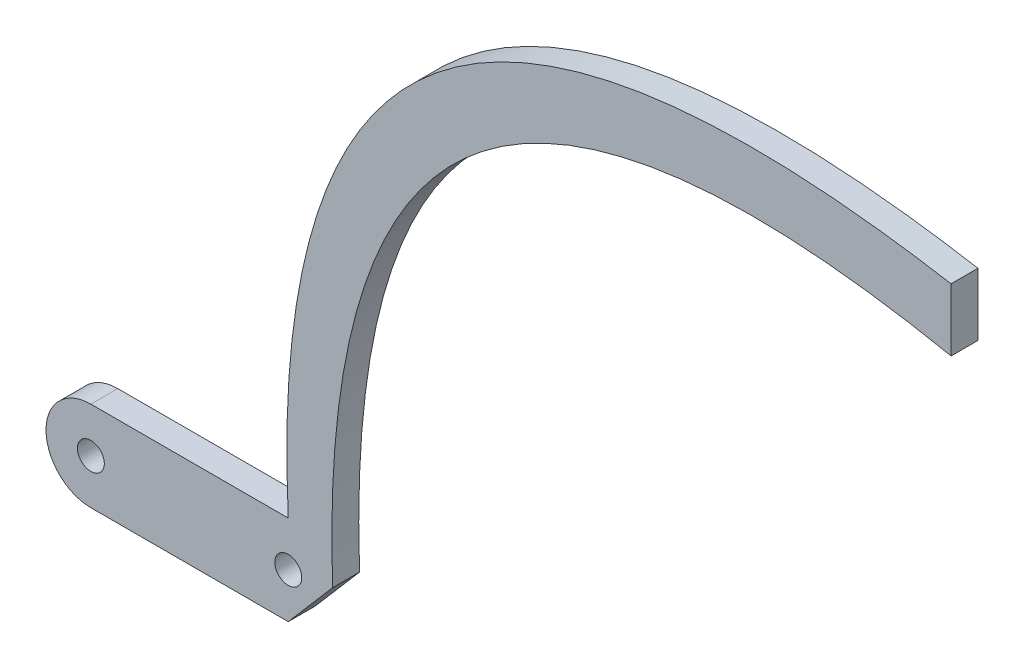
ISO-10303-21;
HEADER;
FILE_DESCRIPTION(('STEP AP214'),'2;1');
FILE_NAME('part.step','',(''),(''),'','','');
FILE_SCHEMA(('AUTOMOTIVE_DESIGN { 1 0 10303 214 1 1 1 1 }'));
ENDSEC;
DATA;
#1=APPLICATION_CONTEXT('core data for automotive mechanical design processes');
#2=APPLICATION_PROTOCOL_DEFINITION('international standard','automotive_design',2000,#1);
#3=PRODUCT_CONTEXT('',#1,'mechanical');
#4=PRODUCT('Part','Part','',(#3));
#5=PRODUCT_RELATED_PRODUCT_CATEGORY('part','',(#4));
#6=PRODUCT_DEFINITION_FORMATION('','',#4);
#7=PRODUCT_DEFINITION_CONTEXT('part definition',#1,'design');
#8=PRODUCT_DEFINITION('design','',#6,#7);
#9=PRODUCT_DEFINITION_SHAPE('','',#8);
#10=(LENGTH_UNIT() NAMED_UNIT(*) SI_UNIT(.MILLI.,.METRE.));
#11=(NAMED_UNIT(*) PLANE_ANGLE_UNIT() SI_UNIT($,.RADIAN.));
#12=(NAMED_UNIT(*) SI_UNIT($,.STERADIAN.) SOLID_ANGLE_UNIT());
#13=UNCERTAINTY_MEASURE_WITH_UNIT(LENGTH_MEASURE(1.E-05),#10,'distance_accuracy_value','');
#14=(GEOMETRIC_REPRESENTATION_CONTEXT(3) GLOBAL_UNCERTAINTY_ASSIGNED_CONTEXT((#13)) GLOBAL_UNIT_ASSIGNED_CONTEXT((#10,
#11,#12)) REPRESENTATION_CONTEXT('',''));
#15=CARTESIAN_POINT('',(0.,0.,0.));
#16=DIRECTION('',(0.,0.,1.));
#17=DIRECTION('',(1.,0.,0.));
#18=AXIS2_PLACEMENT_3D('',#15,#16,#17);
#19=CARTESIAN_POINT('',(15.1236756752499,-12.9997761369161,3.));
#20=DIRECTION('',(0.758348407276689,-0.651849440577277,0.));
#21=DIRECTION('',(0.651849440577277,0.758348407276689,0.));
#22=AXIS2_PLACEMENT_3D('',#19,#20,#21);
#23=PLANE('',#22);
#24=DIRECTION('',(-0.651849440577277,-0.758348407276689,0.));
#25=VECTOR('',#24,1.);
#26=CARTESIAN_POINT('',(15.1236756752499,-12.9997761369161,0.));
#27=LINE('',#26,#25);
#28=CARTESIAN_POINT('',(26.9432898504598,0.750923068190855,0.));
#29=VERTEX_POINT('',#28);
#30=CARTESIAN_POINT('',(22.,-5.,0.));
#31=VERTEX_POINT('',#30);
#32=EDGE_CURVE('E151',#29,#31,#27,.T.);
#33=ORIENTED_EDGE('',*,*,#32,.F.);
#34=DIRECTION('',(0.,0.,-1.));
#35=VECTOR('',#34,1.);
#36=CARTESIAN_POINT('',(26.9432898504598,0.750923068190855,3.));
#37=LINE('',#36,#35);
#38=CARTESIAN_POINT('',(26.9432898504598,0.750923068190855,3.));
#39=VERTEX_POINT('',#38);
#40=EDGE_CURVE('E11',#39,#29,#37,.T.);
#41=ORIENTED_EDGE('',*,*,#40,.F.);
#42=DIRECTION('',(-0.651849440577277,-0.758348407276689,0.));
#43=VECTOR('',#42,1.);
#44=CARTESIAN_POINT('',(15.1236756752499,-12.9997761369161,3.));
#45=LINE('',#44,#43);
#46=CARTESIAN_POINT('',(22.,-5.,3.));
#47=VERTEX_POINT('',#46);
#48=EDGE_CURVE('E208',#39,#47,#45,.T.);
#49=ORIENTED_EDGE('',*,*,#48,.T.);
#50=DIRECTION('',(0.,0.,-1.));
#51=VECTOR('',#50,1.);
#52=CARTESIAN_POINT('',(22.,-5.,3.));
#53=LINE('',#52,#51);
#54=EDGE_CURVE('E91',#47,#31,#53,.T.);
#55=ORIENTED_EDGE('',*,*,#54,.T.);
#56=EDGE_LOOP('',(#33,#41,#49,#55));
#57=FACE_BOUND('',#56,.T.);
#58=ADVANCED_FACE('F41',(#57),#23,.T.);
#59=CARTESIAN_POINT('',(26.9432898504598,0.750923068190855,3.));
#60=CARTESIAN_POINT('',(24.379410310558,72.0753371482104,3.));
#61=CARTESIAN_POINT('',(95.8755016977229,57.5844090581541,3.));
#62=B_SPLINE_CURVE_WITH_KNOTS('',2,(#59,#60,#61),.UNSPECIFIED.,.F.,.F.,(3,3),(0.,1.),.UNSPECIFIED.);
#63=DIRECTION('',(0.,0.,-1.));
#64=VECTOR('',#63,1.);
#65=SURFACE_OF_LINEAR_EXTRUSION('',#62,#64);
#66=CARTESIAN_POINT('',(26.9432898504598,0.750923068190855,0.));
#67=CARTESIAN_POINT('',(24.379410310558,72.0753371482104,0.));
#68=CARTESIAN_POINT('',(95.8755016977229,57.5844090581541,0.));
#69=B_SPLINE_CURVE_WITH_KNOTS('',2,(#66,#67,#68),.UNSPECIFIED.,.F.,.F.,(3,3),(0.,1.),.UNSPECIFIED.);
#70=CARTESIAN_POINT('',(95.8755016977229,57.5844090581541,0.));
#71=VERTEX_POINT('',#70);
#72=EDGE_CURVE('E154',#29,#71,#69,.T.);
#73=ORIENTED_EDGE('',*,*,#72,.T.);
#74=DIRECTION('',(0.,0.,-1.));
#75=VECTOR('',#74,1.);
#76=CARTESIAN_POINT('',(95.8755016977229,57.5844090581541,3.));
#77=LINE('',#76,#75);
#78=CARTESIAN_POINT('',(95.8755016977229,57.5844090581541,3.));
#79=VERTEX_POINT('',#78);
#80=EDGE_CURVE('E51',#79,#71,#77,.T.);
#81=ORIENTED_EDGE('',*,*,#80,.F.);
#82=EDGE_CURVE('E205',#39,#79,#62,.T.);
#83=ORIENTED_EDGE('',*,*,#82,.F.);
#84=ORIENTED_EDGE('',*,*,#40,.T.);
#85=EDGE_LOOP('',(#73,#81,#83,#84));
#86=FACE_BOUND('',#85,.T.);
#87=ADVANCED_FACE('F200',(#86),#65,.F.);
#88=CARTESIAN_POINT('',(95.8755016977229,0.,3.));
#89=DIRECTION('',(1.,0.,0.));
#90=DIRECTION('',(0.,0.,-1.));
#91=AXIS2_PLACEMENT_3D('',#88,#89,#90);
#92=PLANE('',#91);
#93=DIRECTION('',(0.,-1.,0.));
#94=VECTOR('',#93,1.);
#95=CARTESIAN_POINT('',(95.8755016977229,0.,0.));
#96=LINE('',#95,#94);
#97=CARTESIAN_POINT('',(95.8755016977229,64.5504849176923,0.));
#98=VERTEX_POINT('',#97);
#99=EDGE_CURVE('E160',#98,#71,#96,.T.);
#100=ORIENTED_EDGE('',*,*,#99,.F.);
#101=DIRECTION('',(0.,0.,-1.));
#102=VECTOR('',#101,1.);
#103=CARTESIAN_POINT('',(95.8755016977229,64.5504849176923,3.));
#104=LINE('',#103,#102);
#105=CARTESIAN_POINT('',(95.8755016977229,64.5504849176923,3.));
#106=VERTEX_POINT('',#105);
#107=EDGE_CURVE('E190',#106,#98,#104,.T.);
#108=ORIENTED_EDGE('',*,*,#107,.F.);
#109=DIRECTION('',(0.,-1.,0.));
#110=VECTOR('',#109,1.);
#111=CARTESIAN_POINT('',(95.8755016977229,0.,3.));
#112=LINE('',#111,#110);
#113=EDGE_CURVE('E134',#106,#79,#112,.T.);
#114=ORIENTED_EDGE('',*,*,#113,.T.);
#115=ORIENTED_EDGE('',*,*,#80,.T.);
#116=EDGE_LOOP('',(#100,#108,#114,#115));
#117=FACE_BOUND('',#116,.T.);
#118=ADVANCED_FACE('F197',(#117),#92,.T.);
#119=CARTESIAN_POINT('',(22.,5.,3.));
#120=CARTESIAN_POINT('',(18.375967341589,77.9405529320318,3.));
#121=CARTESIAN_POINT('',(95.8755016977229,64.5504849176923,3.));
#122=B_SPLINE_CURVE_WITH_KNOTS('',2,(#119,#120,#121),.UNSPECIFIED.,.F.,.F.,(3,3),(0.,1.),.UNSPECIFIED.);
#123=DIRECTION('',(0.,0.,-1.));
#124=VECTOR('',#123,1.);
#125=SURFACE_OF_LINEAR_EXTRUSION('',#122,#124);
#126=CARTESIAN_POINT('',(22.,5.,0.));
#127=CARTESIAN_POINT('',(18.375967341589,77.9405529320318,0.));
#128=CARTESIAN_POINT('',(95.8755016977229,64.5504849176923,0.));
#129=B_SPLINE_CURVE_WITH_KNOTS('',2,(#126,#127,#128),.UNSPECIFIED.,.F.,.F.,(3,3),(0.,1.),.UNSPECIFIED.);
#130=CARTESIAN_POINT('',(22.,5.,0.));
#131=VERTEX_POINT('',#130);
#132=EDGE_CURVE('E167',#131,#98,#129,.T.);
#133=ORIENTED_EDGE('',*,*,#132,.F.);
#134=DIRECTION('',(0.,0.,-1.));
#135=VECTOR('',#134,1.);
#136=CARTESIAN_POINT('',(22.,5.,3.));
#137=LINE('',#136,#135);
#138=CARTESIAN_POINT('',(22.,5.,3.));
#139=VERTEX_POINT('',#138);
#140=EDGE_CURVE('E118',#139,#131,#137,.T.);
#141=ORIENTED_EDGE('',*,*,#140,.F.);
#142=EDGE_CURVE('E130',#139,#106,#122,.T.);
#143=ORIENTED_EDGE('',*,*,#142,.T.);
#144=ORIENTED_EDGE('',*,*,#107,.T.);
#145=EDGE_LOOP('',(#133,#141,#143,#144));
#146=FACE_BOUND('',#145,.T.);
#147=ADVANCED_FACE('F204',(#146),#125,.T.);
#148=CARTESIAN_POINT('',(0.,5.,3.));
#149=DIRECTION('',(0.,1.,0.));
#150=DIRECTION('',(0.,0.,1.));
#151=AXIS2_PLACEMENT_3D('',#148,#149,#150);
#152=PLANE('',#151);
#153=DIRECTION('',(1.,0.,0.));
#154=VECTOR('',#153,1.);
#155=CARTESIAN_POINT('',(0.,5.,0.));
#156=LINE('',#155,#154);
#157=CARTESIAN_POINT('',(0.,5.,0.));
#158=VERTEX_POINT('',#157);
#159=EDGE_CURVE('E114',#158,#131,#156,.T.);
#160=ORIENTED_EDGE('',*,*,#159,.F.);
#161=DIRECTION('',(0.,0.,-1.));
#162=VECTOR('',#161,1.);
#163=CARTESIAN_POINT('',(0.,5.,3.));
#164=LINE('',#163,#162);
#165=CARTESIAN_POINT('',(0.,5.,3.));
#166=VERTEX_POINT('',#165);
#167=EDGE_CURVE('E108',#166,#158,#164,.T.);
#168=ORIENTED_EDGE('',*,*,#167,.F.);
#169=DIRECTION('',(1.,0.,0.));
#170=VECTOR('',#169,1.);
#171=CARTESIAN_POINT('',(0.,5.,3.));
#172=LINE('',#171,#170);
#173=EDGE_CURVE('E112',#166,#139,#172,.T.);
#174=ORIENTED_EDGE('',*,*,#173,.T.);
#175=ORIENTED_EDGE('',*,*,#140,.T.);
#176=EDGE_LOOP('',(#160,#168,#174,#175));
#177=FACE_BOUND('',#176,.T.);
#178=ADVANCED_FACE('F110',(#177),#152,.T.);
#179=CARTESIAN_POINT('',(0.,0.,3.));
#180=DIRECTION('',(0.,0.,-1.));
#181=DIRECTION('',(-1.,0.,0.));
#182=AXIS2_PLACEMENT_3D('',#179,#180,#181);
#183=CYLINDRICAL_SURFACE('',#182,5.);
#184=CARTESIAN_POINT('',(0.,0.,0.));
#185=DIRECTION('',(0.,0.,1.));
#186=DIRECTION('',(1.,0.,0.));
#187=AXIS2_PLACEMENT_3D('',#184,#185,#186);
#188=CIRCLE('',#187,5.);
#189=CARTESIAN_POINT('',(0.,-5.,0.));
#190=VERTEX_POINT('',#189);
#191=EDGE_CURVE('E178',#158,#190,#188,.T.);
#192=ORIENTED_EDGE('',*,*,#191,.T.);
#193=DIRECTION('',(0.,0.,-1.));
#194=VECTOR('',#193,1.);
#195=CARTESIAN_POINT('',(0.,-5.,3.));
#196=LINE('',#195,#194);
#197=CARTESIAN_POINT('',(0.,-5.,3.));
#198=VERTEX_POINT('',#197);
#199=EDGE_CURVE('E119',#198,#190,#196,.T.);
#200=ORIENTED_EDGE('',*,*,#199,.F.);
#201=CARTESIAN_POINT('',(0.,0.,3.));
#202=DIRECTION('',(0.,0.,1.));
#203=DIRECTION('',(1.,0.,0.));
#204=AXIS2_PLACEMENT_3D('',#201,#202,#203);
#205=CIRCLE('',#204,5.);
#206=EDGE_CURVE('E122',#166,#198,#205,.T.);
#207=ORIENTED_EDGE('',*,*,#206,.F.);
#208=ORIENTED_EDGE('',*,*,#167,.T.);
#209=EDGE_LOOP('',(#192,#200,#207,#208));
#210=FACE_BOUND('',#209,.T.);
#211=ADVANCED_FACE('F123',(#210),#183,.T.);
#212=CARTESIAN_POINT('',(0.,0.,3.));
#213=DIRECTION('',(0.,0.,-1.));
#214=DIRECTION('',(-1.,0.,0.));
#215=AXIS2_PLACEMENT_3D('',#212,#213,#214);
#216=CYLINDRICAL_SURFACE('',#215,1.5);
#217=CARTESIAN_POINT('',(0.,0.,3.));
#218=DIRECTION('',(0.,0.,1.));
#219=DIRECTION('',(1.,0.,0.));
#220=AXIS2_PLACEMENT_3D('',#217,#218,#219);
#221=CIRCLE('',#220,1.5);
#222=CARTESIAN_POINT('',(1.5,0.,3.));
#223=VERTEX_POINT('',#222);
#224=EDGE_CURVE('E237',#223,#223,#221,.T.);
#225=ORIENTED_EDGE('',*,*,#224,.T.);
#226=EDGE_LOOP('',(#225));
#227=FACE_BOUND('',#226,.T.);
#228=CARTESIAN_POINT('',(0.,0.,0.));
#229=DIRECTION('',(0.,0.,1.));
#230=DIRECTION('',(1.,0.,0.));
#231=AXIS2_PLACEMENT_3D('',#228,#229,#230);
#232=CIRCLE('',#231,1.5);
#233=CARTESIAN_POINT('',(1.5,0.,0.));
#234=VERTEX_POINT('',#233);
#235=EDGE_CURVE('E147',#234,#234,#232,.T.);
#236=ORIENTED_EDGE('',*,*,#235,.F.);
#237=EDGE_LOOP('',(#236));
#238=FACE_BOUND('',#237,.T.);
#239=ADVANCED_FACE('F224',(#227,#238),#216,.F.);
#240=CARTESIAN_POINT('',(22.,0.,3.));
#241=DIRECTION('',(0.,0.,-1.));
#242=DIRECTION('',(-1.,0.,0.));
#243=AXIS2_PLACEMENT_3D('',#240,#241,#242);
#244=CYLINDRICAL_SURFACE('',#243,1.5);
#245=CARTESIAN_POINT('',(22.,0.,3.));
#246=DIRECTION('',(0.,0.,1.));
#247=DIRECTION('',(1.,0.,0.));
#248=AXIS2_PLACEMENT_3D('',#245,#246,#247);
#249=CIRCLE('',#248,1.5);
#250=CARTESIAN_POINT('',(23.5,0.,3.));
#251=VERTEX_POINT('',#250);
#252=EDGE_CURVE('E183',#251,#251,#249,.T.);
#253=ORIENTED_EDGE('',*,*,#252,.T.);
#254=EDGE_LOOP('',(#253));
#255=FACE_BOUND('',#254,.T.);
#256=CARTESIAN_POINT('',(22.,0.,0.));
#257=DIRECTION('',(0.,0.,1.));
#258=DIRECTION('',(1.,0.,0.));
#259=AXIS2_PLACEMENT_3D('',#256,#257,#258);
#260=CIRCLE('',#259,1.5);
#261=CARTESIAN_POINT('',(23.5,0.,0.));
#262=VERTEX_POINT('',#261);
#263=EDGE_CURVE('E143',#262,#262,#260,.T.);
#264=ORIENTED_EDGE('',*,*,#263,.F.);
#265=EDGE_LOOP('',(#264));
#266=FACE_BOUND('',#265,.T.);
#267=ADVANCED_FACE('F43',(#255,#266),#244,.F.);
#268=CARTESIAN_POINT('',(0.,-5.,3.));
#269=DIRECTION('',(0.,1.,0.));
#270=DIRECTION('',(0.,0.,1.));
#271=AXIS2_PLACEMENT_3D('',#268,#269,#270);
#272=PLANE('',#271);
#273=DIRECTION('',(1.,0.,0.));
#274=VECTOR('',#273,1.);
#275=CARTESIAN_POINT('',(0.,-5.,0.));
#276=LINE('',#275,#274);
#277=EDGE_CURVE('E84',#190,#31,#276,.T.);
#278=ORIENTED_EDGE('',*,*,#277,.T.);
#279=ORIENTED_EDGE('',*,*,#54,.F.);
#280=DIRECTION('',(1.,0.,0.));
#281=VECTOR('',#280,1.);
#282=CARTESIAN_POINT('',(0.,-5.,3.));
#283=LINE('',#282,#281);
#284=EDGE_CURVE('E59',#198,#47,#283,.T.);
#285=ORIENTED_EDGE('',*,*,#284,.F.);
#286=ORIENTED_EDGE('',*,*,#199,.T.);
#287=EDGE_LOOP('',(#278,#279,#285,#286));
#288=FACE_BOUND('',#287,.T.);
#289=ADVANCED_FACE('F231',(#288),#272,.F.);
#290=CARTESIAN_POINT('',(0.,0.,3.));
#291=DIRECTION('',(0.,0.,1.));
#292=DIRECTION('',(1.,0.,0.));
#293=AXIS2_PLACEMENT_3D('',#290,#291,#292);
#294=PLANE('',#293);
#295=ORIENTED_EDGE('',*,*,#252,.F.);
#296=EDGE_LOOP('',(#295));
#297=FACE_BOUND('',#296,.T.);
#298=ORIENTED_EDGE('',*,*,#224,.F.);
#299=EDGE_LOOP('',(#298));
#300=FACE_BOUND('',#299,.T.);
#301=ORIENTED_EDGE('',*,*,#48,.F.);
#302=ORIENTED_EDGE('',*,*,#82,.T.);
#303=ORIENTED_EDGE('',*,*,#113,.F.);
#304=ORIENTED_EDGE('',*,*,#142,.F.);
#305=ORIENTED_EDGE('',*,*,#173,.F.);
#306=ORIENTED_EDGE('',*,*,#206,.T.);
#307=ORIENTED_EDGE('',*,*,#284,.T.);
#308=EDGE_LOOP('',(#301,#302,#303,#304,#305,#306,#307));
#309=FACE_BOUND('',#308,.T.);
#310=ADVANCED_FACE('F127',(#297,#300,#309),#294,.T.);
#311=CARTESIAN_POINT('',(0.,0.,0.));
#312=DIRECTION('',(0.,0.,1.));
#313=DIRECTION('',(1.,0.,0.));
#314=AXIS2_PLACEMENT_3D('',#311,#312,#313);
#315=PLANE('',#314);
#316=ORIENTED_EDGE('',*,*,#263,.T.);
#317=EDGE_LOOP('',(#316));
#318=FACE_BOUND('',#317,.T.);
#319=ORIENTED_EDGE('',*,*,#235,.T.);
#320=EDGE_LOOP('',(#319));
#321=FACE_BOUND('',#320,.T.);
#322=ORIENTED_EDGE('',*,*,#32,.T.);
#323=ORIENTED_EDGE('',*,*,#277,.F.);
#324=ORIENTED_EDGE('',*,*,#191,.F.);
#325=ORIENTED_EDGE('',*,*,#159,.T.);
#326=ORIENTED_EDGE('',*,*,#132,.T.);
#327=ORIENTED_EDGE('',*,*,#99,.T.);
#328=ORIENTED_EDGE('',*,*,#72,.F.);
#329=EDGE_LOOP('',(#322,#323,#324,#325,#326,#327,#328));
#330=FACE_BOUND('',#329,.T.);
#331=ADVANCED_FACE('F201',(#318,#321,#330),#315,.F.);
#332=CLOSED_SHELL('',(#58,#87,#118,#147,#178,#211,#239,#267,#289,#310,#331));
#333=MANIFOLD_SOLID_BREP('B2',#332);
#334=ADVANCED_BREP_SHAPE_REPRESENTATION('',(#18,#333),#14);
#335=SHAPE_DEFINITION_REPRESENTATION(#9,#334);
ENDSEC;
END-ISO-10303-21;
